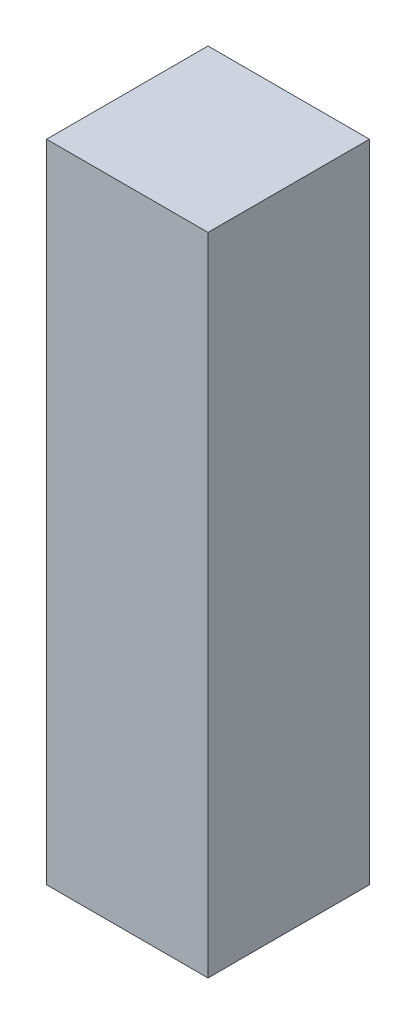
ISO-10303-21;
HEADER;
FILE_DESCRIPTION(('STEP AP214'),'2;1');
FILE_NAME('part.step','',(''),(''),'','','');
FILE_SCHEMA(('AUTOMOTIVE_DESIGN { 1 0 10303 214 1 1 1 1 }'));
ENDSEC;
DATA;
#1=APPLICATION_CONTEXT('core data for automotive mechanical design processes');
#2=APPLICATION_PROTOCOL_DEFINITION('international standard','automotive_design',2000,#1);
#3=PRODUCT_CONTEXT('',#1,'mechanical');
#4=PRODUCT('Part','Part','',(#3));
#5=PRODUCT_RELATED_PRODUCT_CATEGORY('part','',(#4));
#6=PRODUCT_DEFINITION_FORMATION('','',#4);
#7=PRODUCT_DEFINITION_CONTEXT('part definition',#1,'design');
#8=PRODUCT_DEFINITION('design','',#6,#7);
#9=PRODUCT_DEFINITION_SHAPE('','',#8);
#10=(LENGTH_UNIT() NAMED_UNIT(*) SI_UNIT(.MILLI.,.METRE.));
#11=(NAMED_UNIT(*) PLANE_ANGLE_UNIT() SI_UNIT($,.RADIAN.));
#12=(NAMED_UNIT(*) SI_UNIT($,.STERADIAN.) SOLID_ANGLE_UNIT());
#13=UNCERTAINTY_MEASURE_WITH_UNIT(LENGTH_MEASURE(1.E-05),#10,'distance_accuracy_value','');
#14=(GEOMETRIC_REPRESENTATION_CONTEXT(3) GLOBAL_UNCERTAINTY_ASSIGNED_CONTEXT((#13)) GLOBAL_UNIT_ASSIGNED_CONTEXT((#10,
#11,#12)) REPRESENTATION_CONTEXT('',''));
#15=CARTESIAN_POINT('',(0.,0.,0.));
#16=DIRECTION('',(0.,0.,1.));
#17=DIRECTION('',(1.,0.,0.));
#18=AXIS2_PLACEMENT_3D('',#15,#16,#17);
#19=CARTESIAN_POINT('',(1.5875,12.7,1.5875));
#20=DIRECTION('',(-1.,0.,0.));
#21=DIRECTION('',(0.,0.,1.));
#22=AXIS2_PLACEMENT_3D('',#19,#20,#21);
#23=PLANE('',#22);
#24=DIRECTION('',(0.,0.,-1.));
#25=VECTOR('',#24,1.);
#26=CARTESIAN_POINT('',(1.5875,0.,1.5875));
#27=LINE('',#26,#25);
#28=CARTESIAN_POINT('',(1.5875,0.,1.5875));
#29=VERTEX_POINT('',#28);
#30=CARTESIAN_POINT('',(1.5875,0.,-1.5875));
#31=VERTEX_POINT('',#30);
#32=EDGE_CURVE('E107',#29,#31,#27,.T.);
#33=ORIENTED_EDGE('',*,*,#32,.T.);
#34=DIRECTION('',(0.,-1.,0.));
#35=VECTOR('',#34,1.);
#36=CARTESIAN_POINT('',(1.5875,12.7,-1.5875));
#37=LINE('',#36,#35);
#38=CARTESIAN_POINT('',(1.5875,12.7,-1.5875));
#39=VERTEX_POINT('',#38);
#40=EDGE_CURVE('E11',#39,#31,#37,.T.);
#41=ORIENTED_EDGE('',*,*,#40,.F.);
#42=DIRECTION('',(0.,0.,-1.));
#43=VECTOR('',#42,1.);
#44=CARTESIAN_POINT('',(1.5875,12.7,1.5875));
#45=LINE('',#44,#43);
#46=CARTESIAN_POINT('',(1.5875,12.7,1.5875));
#47=VERTEX_POINT('',#46);
#48=EDGE_CURVE('E91',#47,#39,#45,.T.);
#49=ORIENTED_EDGE('',*,*,#48,.F.);
#50=DIRECTION('',(0.,-1.,0.));
#51=VECTOR('',#50,1.);
#52=CARTESIAN_POINT('',(1.5875,12.7,1.5875));
#53=LINE('',#52,#51);
#54=EDGE_CURVE('E103',#47,#29,#53,.T.);
#55=ORIENTED_EDGE('',*,*,#54,.T.);
#56=EDGE_LOOP('',(#33,#41,#49,#55));
#57=FACE_BOUND('',#56,.T.);
#58=ADVANCED_FACE('F39',(#57),#23,.F.);
#59=CARTESIAN_POINT('',(-1.5875,12.7,-1.5875));
#60=DIRECTION('',(0.,0.,1.));
#61=DIRECTION('',(1.,0.,0.));
#62=AXIS2_PLACEMENT_3D('',#59,#60,#61);
#63=PLANE('',#62);
#64=DIRECTION('',(-1.,0.,0.));
#65=VECTOR('',#64,1.);
#66=CARTESIAN_POINT('',(-1.5875,0.,-1.5875));
#67=LINE('',#66,#65);
#68=CARTESIAN_POINT('',(-1.5875,0.,-1.5875));
#69=VERTEX_POINT('',#68);
#70=EDGE_CURVE('E96',#31,#69,#67,.T.);
#71=ORIENTED_EDGE('',*,*,#70,.T.);
#72=DIRECTION('',(0.,-1.,0.));
#73=VECTOR('',#72,1.);
#74=CARTESIAN_POINT('',(-1.5875,12.7,-1.5875));
#75=LINE('',#74,#73);
#76=CARTESIAN_POINT('',(-1.5875,12.7,-1.5875));
#77=VERTEX_POINT('',#76);
#78=EDGE_CURVE('E48',#77,#69,#75,.T.);
#79=ORIENTED_EDGE('',*,*,#78,.F.);
#80=DIRECTION('',(-1.,0.,0.));
#81=VECTOR('',#80,1.);
#82=CARTESIAN_POINT('',(-1.5875,12.7,-1.5875));
#83=LINE('',#82,#81);
#84=EDGE_CURVE('E86',#39,#77,#83,.T.);
#85=ORIENTED_EDGE('',*,*,#84,.F.);
#86=ORIENTED_EDGE('',*,*,#40,.T.);
#87=EDGE_LOOP('',(#71,#79,#85,#86));
#88=FACE_BOUND('',#87,.T.);
#89=ADVANCED_FACE('F95',(#88),#63,.F.);
#90=CARTESIAN_POINT('',(-1.5875,12.7,1.5875));
#91=DIRECTION('',(1.,0.,0.));
#92=DIRECTION('',(0.,0.,-1.));
#93=AXIS2_PLACEMENT_3D('',#90,#91,#92);
#94=PLANE('',#93);
#95=DIRECTION('',(0.,0.,1.));
#96=VECTOR('',#95,1.);
#97=CARTESIAN_POINT('',(-1.5875,0.,1.5875));
#98=LINE('',#97,#96);
#99=CARTESIAN_POINT('',(-1.5875,0.,1.5875));
#100=VERTEX_POINT('',#99);
#101=EDGE_CURVE('E73',#69,#100,#98,.T.);
#102=ORIENTED_EDGE('',*,*,#101,.T.);
#103=DIRECTION('',(0.,-1.,0.));
#104=VECTOR('',#103,1.);
#105=CARTESIAN_POINT('',(-1.5875,12.7,1.5875));
#106=LINE('',#105,#104);
#107=CARTESIAN_POINT('',(-1.5875,12.7,1.5875));
#108=VERTEX_POINT('',#107);
#109=EDGE_CURVE('E98',#108,#100,#106,.T.);
#110=ORIENTED_EDGE('',*,*,#109,.F.);
#111=DIRECTION('',(0.,0.,1.));
#112=VECTOR('',#111,1.);
#113=CARTESIAN_POINT('',(-1.5875,12.7,1.5875));
#114=LINE('',#113,#112);
#115=EDGE_CURVE('E89',#77,#108,#114,.T.);
#116=ORIENTED_EDGE('',*,*,#115,.F.);
#117=ORIENTED_EDGE('',*,*,#78,.T.);
#118=EDGE_LOOP('',(#102,#110,#116,#117));
#119=FACE_BOUND('',#118,.T.);
#120=ADVANCED_FACE('F99',(#119),#94,.F.);
#121=CARTESIAN_POINT('',(-1.5875,12.7,1.5875));
#122=DIRECTION('',(0.,0.,-1.));
#123=DIRECTION('',(-1.,0.,0.));
#124=AXIS2_PLACEMENT_3D('',#121,#122,#123);
#125=PLANE('',#124);
#126=DIRECTION('',(1.,0.,0.));
#127=VECTOR('',#126,1.);
#128=CARTESIAN_POINT('',(-1.5875,0.,1.5875));
#129=LINE('',#128,#127);
#130=EDGE_CURVE('E79',#100,#29,#129,.T.);
#131=ORIENTED_EDGE('',*,*,#130,.T.);
#132=ORIENTED_EDGE('',*,*,#54,.F.);
#133=DIRECTION('',(1.,0.,0.));
#134=VECTOR('',#133,1.);
#135=CARTESIAN_POINT('',(-1.5875,12.7,1.5875));
#136=LINE('',#135,#134);
#137=EDGE_CURVE('E56',#108,#47,#136,.T.);
#138=ORIENTED_EDGE('',*,*,#137,.F.);
#139=ORIENTED_EDGE('',*,*,#109,.T.);
#140=EDGE_LOOP('',(#131,#132,#138,#139));
#141=FACE_BOUND('',#140,.T.);
#142=ADVANCED_FACE('F120',(#141),#125,.F.);
#143=CARTESIAN_POINT('',(0.,12.7,0.));
#144=DIRECTION('',(0.,-1.,0.));
#145=DIRECTION('',(0.,0.,-1.));
#146=AXIS2_PLACEMENT_3D('',#143,#144,#145);
#147=PLANE('',#146);
#148=ORIENTED_EDGE('',*,*,#48,.T.);
#149=ORIENTED_EDGE('',*,*,#84,.T.);
#150=ORIENTED_EDGE('',*,*,#115,.T.);
#151=ORIENTED_EDGE('',*,*,#137,.T.);
#152=EDGE_LOOP('',(#148,#149,#150,#151));
#153=FACE_BOUND('',#152,.T.);
#154=ADVANCED_FACE('F87',(#153),#147,.F.);
#155=CARTESIAN_POINT('',(0.,0.,0.));
#156=DIRECTION('',(0.,-1.,0.));
#157=DIRECTION('',(0.,0.,-1.));
#158=AXIS2_PLACEMENT_3D('',#155,#156,#157);
#159=PLANE('',#158);
#160=ORIENTED_EDGE('',*,*,#32,.F.);
#161=ORIENTED_EDGE('',*,*,#130,.F.);
#162=ORIENTED_EDGE('',*,*,#101,.F.);
#163=ORIENTED_EDGE('',*,*,#70,.F.);
#164=EDGE_LOOP('',(#160,#161,#162,#163));
#165=FACE_BOUND('',#164,.T.);
#166=ADVANCED_FACE('F123',(#165),#159,.T.);
#167=CLOSED_SHELL('',(#58,#89,#120,#142,#154,#166));
#168=MANIFOLD_SOLID_BREP('B2',#167);
#169=ADVANCED_BREP_SHAPE_REPRESENTATION('',(#18,#168),#14);
#170=SHAPE_DEFINITION_REPRESENTATION(#9,#169);
ENDSEC;
END-ISO-10303-21;
